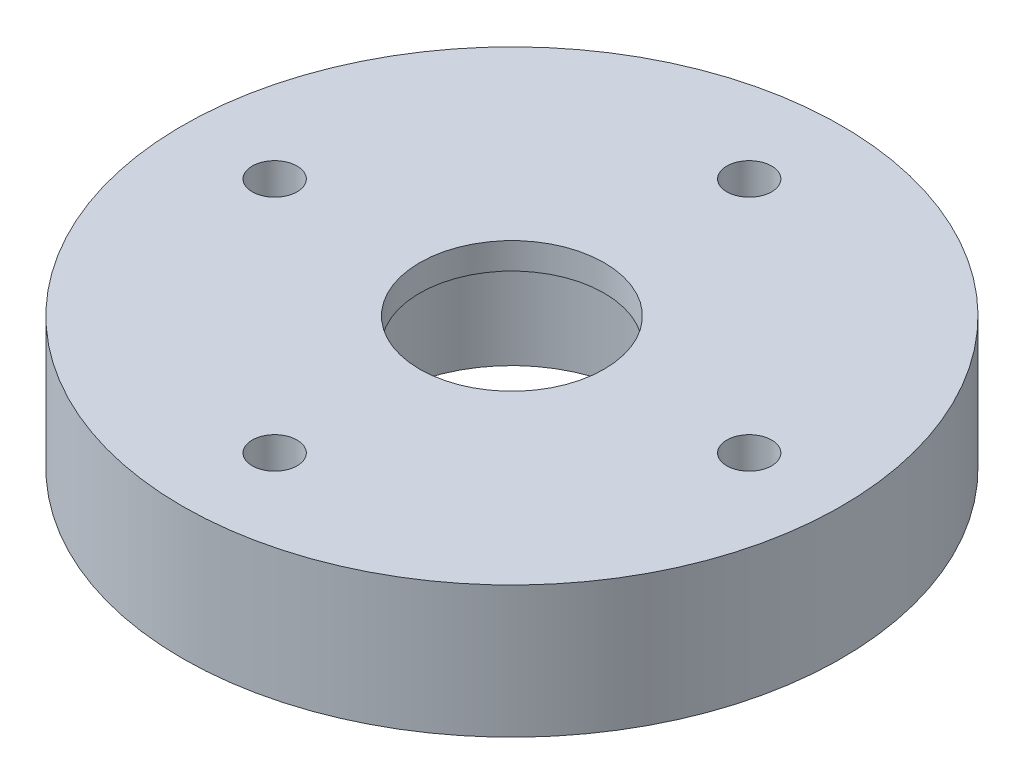
ISO-10303-21;
HEADER;
FILE_DESCRIPTION(('STEP AP214'),'2;1');
FILE_NAME('part.step','',(''),(''),'','','');
FILE_SCHEMA(('AUTOMOTIVE_DESIGN { 1 0 10303 214 1 1 1 1 }'));
ENDSEC;
DATA;
#1=APPLICATION_CONTEXT('core data for automotive mechanical design processes');
#2=APPLICATION_PROTOCOL_DEFINITION('international standard','automotive_design',2000,#1);
#3=PRODUCT_CONTEXT('',#1,'mechanical');
#4=PRODUCT('Part','Part','',(#3));
#5=PRODUCT_RELATED_PRODUCT_CATEGORY('part','',(#4));
#6=PRODUCT_DEFINITION_FORMATION('','',#4);
#7=PRODUCT_DEFINITION_CONTEXT('part definition',#1,'design');
#8=PRODUCT_DEFINITION('design','',#6,#7);
#9=PRODUCT_DEFINITION_SHAPE('','',#8);
#10=(LENGTH_UNIT() NAMED_UNIT(*) SI_UNIT(.MILLI.,.METRE.));
#11=(NAMED_UNIT(*) PLANE_ANGLE_UNIT() SI_UNIT($,.RADIAN.));
#12=(NAMED_UNIT(*) SI_UNIT($,.STERADIAN.) SOLID_ANGLE_UNIT());
#13=UNCERTAINTY_MEASURE_WITH_UNIT(LENGTH_MEASURE(1.E-05),#10,'distance_accuracy_value','');
#14=(GEOMETRIC_REPRESENTATION_CONTEXT(3) GLOBAL_UNCERTAINTY_ASSIGNED_CONTEXT((#13)) GLOBAL_UNIT_ASSIGNED_CONTEXT((#10,
#11,#12)) REPRESENTATION_CONTEXT('',''));
#15=CARTESIAN_POINT('',(0.,0.,0.));
#16=DIRECTION('',(0.,0.,1.));
#17=DIRECTION('',(1.,0.,0.));
#18=AXIS2_PLACEMENT_3D('',#15,#16,#17);
#19=CARTESIAN_POINT('',(0.,10.,-18.));
#20=DIRECTION('',(0.,-1.,0.));
#21=DIRECTION('',(0.,0.,-1.));
#22=AXIS2_PLACEMENT_3D('',#19,#20,#21);
#23=CYLINDRICAL_SURFACE('',#22,1.7);
#24=CARTESIAN_POINT('',(0.,10.,-18.));
#25=DIRECTION('',(0.,1.,0.));
#26=DIRECTION('',(0.,0.,1.));
#27=AXIS2_PLACEMENT_3D('',#24,#25,#26);
#28=CIRCLE('',#27,1.7);
#29=CARTESIAN_POINT('',(0.,10.,-16.3));
#30=VERTEX_POINT('',#29);
#31=EDGE_CURVE('E83',#30,#30,#28,.T.);
#32=ORIENTED_EDGE('',*,*,#31,.T.);
#33=EDGE_LOOP('',(#32));
#34=FACE_BOUND('',#33,.T.);
#35=CARTESIAN_POINT('',(0.,7.,-18.));
#36=DIRECTION('',(0.,-1.,0.));
#37=DIRECTION('',(0.,0.,-1.));
#38=AXIS2_PLACEMENT_3D('',#35,#36,#37);
#39=CIRCLE('',#38,1.7);
#40=CARTESIAN_POINT('',(0.,7.,-19.7));
#41=VERTEX_POINT('',#40);
#42=EDGE_CURVE('E35',#41,#41,#39,.T.);
#43=ORIENTED_EDGE('',*,*,#42,.T.);
#44=EDGE_LOOP('',(#43));
#45=FACE_BOUND('',#44,.T.);
#46=ADVANCED_FACE('F31',(#34,#45),#23,.F.);
#47=CARTESIAN_POINT('',(18.0000000000005,10.,-5.08284223389574E-13));
#48=DIRECTION('',(0.,-1.,0.));
#49=DIRECTION('',(0.,0.,-1.));
#50=AXIS2_PLACEMENT_3D('',#47,#48,#49);
#51=CYLINDRICAL_SURFACE('',#50,1.7000000000004);
#52=CARTESIAN_POINT('',(18.0000000000005,10.,-5.08284223389574E-13));
#53=DIRECTION('',(0.,1.,0.));
#54=DIRECTION('',(0.,0.,1.));
#55=AXIS2_PLACEMENT_3D('',#52,#53,#54);
#56=CIRCLE('',#55,1.7000000000004);
#57=CARTESIAN_POINT('',(18.0000000000005,10.,1.69999999999989));
#58=VERTEX_POINT('',#57);
#59=EDGE_CURVE('E81',#58,#58,#56,.T.);
#60=ORIENTED_EDGE('',*,*,#59,.T.);
#61=EDGE_LOOP('',(#60));
#62=FACE_BOUND('',#61,.T.);
#63=CARTESIAN_POINT('',(18.0000000000005,7.,-5.08284223389574E-13));
#64=DIRECTION('',(0.,-1.,0.));
#65=DIRECTION('',(0.,0.,-1.));
#66=AXIS2_PLACEMENT_3D('',#63,#64,#65);
#67=CIRCLE('',#66,1.7000000000004);
#68=CARTESIAN_POINT('',(18.0000000000005,7.,-1.70000000000091));
#69=VERTEX_POINT('',#68);
#70=EDGE_CURVE('E60',#69,#69,#67,.T.);
#71=ORIENTED_EDGE('',*,*,#70,.T.);
#72=EDGE_LOOP('',(#71));
#73=FACE_BOUND('',#72,.T.);
#74=ADVANCED_FACE('F159',(#62,#73),#51,.F.);
#75=CARTESIAN_POINT('',(1.01656844677915E-12,10.,18.));
#76=DIRECTION('',(0.,-1.,0.));
#77=DIRECTION('',(0.,0.,-1.));
#78=AXIS2_PLACEMENT_3D('',#75,#76,#77);
#79=CYLINDRICAL_SURFACE('',#78,1.70000000000109);
#80=CARTESIAN_POINT('',(1.01656844677915E-12,10.,18.));
#81=DIRECTION('',(0.,1.,0.));
#82=DIRECTION('',(0.,0.,1.));
#83=AXIS2_PLACEMENT_3D('',#80,#81,#82);
#84=CIRCLE('',#83,1.70000000000109);
#85=CARTESIAN_POINT('',(1.01656844677915E-12,10.,19.7000000000011));
#86=VERTEX_POINT('',#85);
#87=EDGE_CURVE('E78',#86,#86,#84,.T.);
#88=ORIENTED_EDGE('',*,*,#87,.T.);
#89=EDGE_LOOP('',(#88));
#90=FACE_BOUND('',#89,.T.);
#91=CARTESIAN_POINT('',(1.01656844677915E-12,7.,18.));
#92=DIRECTION('',(0.,-1.,0.));
#93=DIRECTION('',(0.,0.,-1.));
#94=AXIS2_PLACEMENT_3D('',#91,#92,#93);
#95=CIRCLE('',#94,1.70000000000109);
#96=CARTESIAN_POINT('',(1.01656844677915E-12,7.,16.2999999999989));
#97=VERTEX_POINT('',#96);
#98=EDGE_CURVE('E57',#97,#97,#95,.T.);
#99=ORIENTED_EDGE('',*,*,#98,.T.);
#100=EDGE_LOOP('',(#99));
#101=FACE_BOUND('',#100,.T.);
#102=ADVANCED_FACE('F106',(#90,#101),#79,.F.);
#103=CARTESIAN_POINT('',(-17.9999999999995,10.,5.10488587628039E-13));
#104=DIRECTION('',(0.,-1.,0.));
#105=DIRECTION('',(0.,0.,-1.));
#106=AXIS2_PLACEMENT_3D('',#103,#104,#105);
#107=CYLINDRICAL_SURFACE('',#106,1.70000000000082);
#108=CARTESIAN_POINT('',(-17.9999999999995,10.,5.10488587628039E-13));
#109=DIRECTION('',(0.,1.,0.));
#110=DIRECTION('',(0.,0.,1.));
#111=AXIS2_PLACEMENT_3D('',#108,#109,#110);
#112=CIRCLE('',#111,1.70000000000082);
#113=CARTESIAN_POINT('',(-17.9999999999995,10.,1.70000000000133));
#114=VERTEX_POINT('',#113);
#115=EDGE_CURVE('E52',#114,#114,#112,.T.);
#116=ORIENTED_EDGE('',*,*,#115,.T.);
#117=EDGE_LOOP('',(#116));
#118=FACE_BOUND('',#117,.T.);
#119=CARTESIAN_POINT('',(-17.9999999999995,7.,5.10488587628039E-13));
#120=DIRECTION('',(0.,-1.,0.));
#121=DIRECTION('',(0.,0.,-1.));
#122=AXIS2_PLACEMENT_3D('',#119,#120,#121);
#123=CIRCLE('',#122,1.70000000000082);
#124=CARTESIAN_POINT('',(-17.9999999999995,7.,-1.7000000000003));
#125=VERTEX_POINT('',#124);
#126=EDGE_CURVE('E54',#125,#125,#123,.T.);
#127=ORIENTED_EDGE('',*,*,#126,.T.);
#128=EDGE_LOOP('',(#127));
#129=FACE_BOUND('',#128,.T.);
#130=ADVANCED_FACE('F103',(#118,#129),#107,.F.);
#131=CARTESIAN_POINT('',(0.,10.,0.));
#132=DIRECTION('',(0.,-1.,0.));
#133=DIRECTION('',(0.,0.,-1.));
#134=AXIS2_PLACEMENT_3D('',#131,#132,#133);
#135=CYLINDRICAL_SURFACE('',#134,7.);
#136=CARTESIAN_POINT('',(0.,10.,0.));
#137=DIRECTION('',(0.,1.,0.));
#138=DIRECTION('',(0.,0.,1.));
#139=AXIS2_PLACEMENT_3D('',#136,#137,#138);
#140=CIRCLE('',#139,7.);
#141=CARTESIAN_POINT('',(0.,10.,7.));
#142=VERTEX_POINT('',#141);
#143=EDGE_CURVE('E44',#142,#142,#140,.T.);
#144=ORIENTED_EDGE('',*,*,#143,.T.);
#145=EDGE_LOOP('',(#144));
#146=FACE_BOUND('',#145,.T.);
#147=CARTESIAN_POINT('',(0.,8.,0.));
#148=DIRECTION('',(0.,-1.,0.));
#149=DIRECTION('',(0.,0.,-1.));
#150=AXIS2_PLACEMENT_3D('',#147,#148,#149);
#151=CIRCLE('',#150,7.);
#152=CARTESIAN_POINT('',(0.,8.,-7.));
#153=VERTEX_POINT('',#152);
#154=EDGE_CURVE('E49',#153,#153,#151,.T.);
#155=ORIENTED_EDGE('',*,*,#154,.T.);
#156=EDGE_LOOP('',(#155));
#157=FACE_BOUND('',#156,.T.);
#158=ADVANCED_FACE('F90',(#146,#157),#135,.F.);
#159=CARTESIAN_POINT('',(0.,10.,0.));
#160=DIRECTION('',(0.,1.,0.));
#161=DIRECTION('',(0.,0.,1.));
#162=AXIS2_PLACEMENT_3D('',#159,#160,#161);
#163=PLANE('',#162);
#164=ORIENTED_EDGE('',*,*,#87,.F.);
#165=EDGE_LOOP('',(#164));
#166=FACE_BOUND('',#165,.T.);
#167=ORIENTED_EDGE('',*,*,#31,.F.);
#168=EDGE_LOOP('',(#167));
#169=FACE_BOUND('',#168,.T.);
#170=CARTESIAN_POINT('',(0.,10.,0.));
#171=DIRECTION('',(0.,1.,0.));
#172=DIRECTION('',(0.,0.,1.));
#173=AXIS2_PLACEMENT_3D('',#170,#171,#172);
#174=CIRCLE('',#173,25.);
#175=CARTESIAN_POINT('',(0.,10.,25.));
#176=VERTEX_POINT('',#175);
#177=EDGE_CURVE('E10',#176,#176,#174,.T.);
#178=ORIENTED_EDGE('',*,*,#177,.T.);
#179=EDGE_LOOP('',(#178));
#180=FACE_BOUND('',#179,.T.);
#181=ORIENTED_EDGE('',*,*,#143,.F.);
#182=EDGE_LOOP('',(#181));
#183=FACE_BOUND('',#182,.T.);
#184=ORIENTED_EDGE('',*,*,#59,.F.);
#185=EDGE_LOOP('',(#184));
#186=FACE_BOUND('',#185,.T.);
#187=ORIENTED_EDGE('',*,*,#115,.F.);
#188=EDGE_LOOP('',(#187));
#189=FACE_BOUND('',#188,.T.);
#190=ADVANCED_FACE('F93',(#166,#169,#180,#183,#186,#189),#163,.T.);
#191=CARTESIAN_POINT('',(0.,0.,0.));
#192=DIRECTION('',(0.,1.,0.));
#193=DIRECTION('',(0.,0.,1.));
#194=AXIS2_PLACEMENT_3D('',#191,#192,#193);
#195=PLANE('',#194);
#196=CARTESIAN_POINT('',(1.01656844677915E-12,0.,18.));
#197=DIRECTION('',(0.,-1.,0.));
#198=DIRECTION('',(0.,0.,-1.));
#199=AXIS2_PLACEMENT_3D('',#196,#197,#198);
#200=CIRCLE('',#199,3.);
#201=CARTESIAN_POINT('',(1.01656844677915E-12,0.,15.));
#202=VERTEX_POINT('',#201);
#203=EDGE_CURVE('E120',#202,#202,#200,.T.);
#204=ORIENTED_EDGE('',*,*,#203,.F.);
#205=EDGE_LOOP('',(#204));
#206=FACE_BOUND('',#205,.T.);
#207=CARTESIAN_POINT('',(-17.9999999999995,0.,5.10008701937181E-13));
#208=DIRECTION('',(0.,-1.,0.));
#209=DIRECTION('',(0.,0.,-1.));
#210=AXIS2_PLACEMENT_3D('',#207,#208,#209);
#211=CIRCLE('',#210,3.);
#212=CARTESIAN_POINT('',(-17.9999999999995,0.,-2.99999999999949));
#213=VERTEX_POINT('',#212);
#214=EDGE_CURVE('E121',#213,#213,#211,.T.);
#215=ORIENTED_EDGE('',*,*,#214,.F.);
#216=EDGE_LOOP('',(#215));
#217=FACE_BOUND('',#216,.T.);
#218=CARTESIAN_POINT('',(0.,0.,-18.));
#219=DIRECTION('',(0.,-1.,0.));
#220=DIRECTION('',(0.,0.,-1.));
#221=AXIS2_PLACEMENT_3D('',#218,#219,#220);
#222=CIRCLE('',#221,3.);
#223=CARTESIAN_POINT('',(0.,0.,-21.));
#224=VERTEX_POINT('',#223);
#225=EDGE_CURVE('E132',#224,#224,#222,.T.);
#226=ORIENTED_EDGE('',*,*,#225,.F.);
#227=EDGE_LOOP('',(#226));
#228=FACE_BOUND('',#227,.T.);
#229=CARTESIAN_POINT('',(18.0000000000005,0.,-5.10008701937181E-13));
#230=DIRECTION('',(0.,-1.,0.));
#231=DIRECTION('',(0.,0.,-1.));
#232=AXIS2_PLACEMENT_3D('',#229,#230,#231);
#233=CIRCLE('',#232,3.);
#234=CARTESIAN_POINT('',(18.0000000000005,0.,-3.00000000000051));
#235=VERTEX_POINT('',#234);
#236=EDGE_CURVE('E137',#235,#235,#233,.T.);
#237=ORIENTED_EDGE('',*,*,#236,.F.);
#238=EDGE_LOOP('',(#237));
#239=FACE_BOUND('',#238,.T.);
#240=CARTESIAN_POINT('',(0.,0.,0.));
#241=DIRECTION('',(0.,-1.,0.));
#242=DIRECTION('',(0.,0.,-1.));
#243=AXIS2_PLACEMENT_3D('',#240,#241,#242);
#244=CIRCLE('',#243,9.53);
#245=CARTESIAN_POINT('',(0.,0.,-9.53));
#246=VERTEX_POINT('',#245);
#247=EDGE_CURVE('E65',#246,#246,#244,.T.);
#248=ORIENTED_EDGE('',*,*,#247,.F.);
#249=EDGE_LOOP('',(#248));
#250=FACE_BOUND('',#249,.T.);
#251=CARTESIAN_POINT('',(0.,0.,0.));
#252=DIRECTION('',(0.,1.,0.));
#253=DIRECTION('',(0.,0.,1.));
#254=AXIS2_PLACEMENT_3D('',#251,#252,#253);
#255=CIRCLE('',#254,25.);
#256=CARTESIAN_POINT('',(0.,0.,25.));
#257=VERTEX_POINT('',#256);
#258=EDGE_CURVE('E39',#257,#257,#255,.T.);
#259=ORIENTED_EDGE('',*,*,#258,.F.);
#260=EDGE_LOOP('',(#259));
#261=FACE_BOUND('',#260,.T.);
#262=ADVANCED_FACE('F96',(#206,#217,#228,#239,#250,#261),#195,.F.);
#263=CARTESIAN_POINT('',(0.,10.,0.));
#264=DIRECTION('',(0.,-1.,0.));
#265=DIRECTION('',(0.,0.,-1.));
#266=AXIS2_PLACEMENT_3D('',#263,#264,#265);
#267=CYLINDRICAL_SURFACE('',#266,25.);
#268=ORIENTED_EDGE('',*,*,#177,.F.);
#269=EDGE_LOOP('',(#268));
#270=FACE_BOUND('',#269,.T.);
#271=ORIENTED_EDGE('',*,*,#258,.T.);
#272=EDGE_LOOP('',(#271));
#273=FACE_BOUND('',#272,.T.);
#274=ADVANCED_FACE('F33',(#270,#273),#267,.T.);
#275=CARTESIAN_POINT('',(0.,8.,0.));
#276=DIRECTION('',(0.,-1.,0.));
#277=DIRECTION('',(0.,0.,-1.));
#278=AXIS2_PLACEMENT_3D('',#275,#276,#277);
#279=CYLINDRICAL_SURFACE('',#278,9.53);
#280=CARTESIAN_POINT('',(0.,8.,0.));
#281=DIRECTION('',(0.,-1.,0.));
#282=DIRECTION('',(0.,0.,-1.));
#283=AXIS2_PLACEMENT_3D('',#280,#281,#282);
#284=CIRCLE('',#283,9.53);
#285=CARTESIAN_POINT('',(0.,8.,-9.53));
#286=VERTEX_POINT('',#285);
#287=EDGE_CURVE('E53',#286,#286,#284,.T.);
#288=ORIENTED_EDGE('',*,*,#287,.F.);
#289=EDGE_LOOP('',(#288));
#290=FACE_BOUND('',#289,.T.);
#291=ORIENTED_EDGE('',*,*,#247,.T.);
#292=EDGE_LOOP('',(#291));
#293=FACE_BOUND('',#292,.T.);
#294=ADVANCED_FACE('F150',(#290,#293),#279,.F.);
#295=CARTESIAN_POINT('',(0.,8.,0.));
#296=DIRECTION('',(0.,-1.,0.));
#297=DIRECTION('',(0.,0.,-1.));
#298=AXIS2_PLACEMENT_3D('',#295,#296,#297);
#299=PLANE('',#298);
#300=ORIENTED_EDGE('',*,*,#154,.F.);
#301=EDGE_LOOP('',(#300));
#302=FACE_BOUND('',#301,.T.);
#303=ORIENTED_EDGE('',*,*,#287,.T.);
#304=EDGE_LOOP('',(#303));
#305=FACE_BOUND('',#304,.T.);
#306=ADVANCED_FACE('F155',(#302,#305),#299,.T.);
#307=CARTESIAN_POINT('',(-17.9999999999995,7.,5.10008701937181E-13));
#308=DIRECTION('',(0.,-1.,0.));
#309=DIRECTION('',(0.,0.,-1.));
#310=AXIS2_PLACEMENT_3D('',#307,#308,#309);
#311=CYLINDRICAL_SURFACE('',#310,3.);
#312=CARTESIAN_POINT('',(-17.9999999999995,7.,5.10008701937181E-13));
#313=DIRECTION('',(0.,-1.,0.));
#314=DIRECTION('',(0.,0.,-1.));
#315=AXIS2_PLACEMENT_3D('',#312,#313,#314);
#316=CIRCLE('',#315,3.);
#317=CARTESIAN_POINT('',(-17.9999999999995,7.,-2.99999999999949));
#318=VERTEX_POINT('',#317);
#319=EDGE_CURVE('E118',#318,#318,#316,.T.);
#320=ORIENTED_EDGE('',*,*,#319,.F.);
#321=EDGE_LOOP('',(#320));
#322=FACE_BOUND('',#321,.T.);
#323=ORIENTED_EDGE('',*,*,#214,.T.);
#324=EDGE_LOOP('',(#323));
#325=FACE_BOUND('',#324,.T.);
#326=ADVANCED_FACE('F114',(#322,#325),#311,.F.);
#327=CARTESIAN_POINT('',(-17.9999999999995,7.,5.10008701937181E-13));
#328=DIRECTION('',(0.,-1.,0.));
#329=DIRECTION('',(0.,0.,-1.));
#330=AXIS2_PLACEMENT_3D('',#327,#328,#329);
#331=PLANE('',#330);
#332=ORIENTED_EDGE('',*,*,#126,.F.);
#333=EDGE_LOOP('',(#332));
#334=FACE_BOUND('',#333,.T.);
#335=ORIENTED_EDGE('',*,*,#319,.T.);
#336=EDGE_LOOP('',(#335));
#337=FACE_BOUND('',#336,.T.);
#338=ADVANCED_FACE('F110',(#334,#337),#331,.T.);
#339=CARTESIAN_POINT('',(1.01656844677915E-12,7.,18.));
#340=DIRECTION('',(0.,-1.,0.));
#341=DIRECTION('',(0.,0.,-1.));
#342=AXIS2_PLACEMENT_3D('',#339,#340,#341);
#343=CYLINDRICAL_SURFACE('',#342,3.);
#344=CARTESIAN_POINT('',(1.01656844677915E-12,7.,18.));
#345=DIRECTION('',(0.,-1.,0.));
#346=DIRECTION('',(0.,0.,-1.));
#347=AXIS2_PLACEMENT_3D('',#344,#345,#346);
#348=CIRCLE('',#347,3.);
#349=CARTESIAN_POINT('',(1.01656844677915E-12,7.,15.));
#350=VERTEX_POINT('',#349);
#351=EDGE_CURVE('E58',#350,#350,#348,.T.);
#352=ORIENTED_EDGE('',*,*,#351,.F.);
#353=EDGE_LOOP('',(#352));
#354=FACE_BOUND('',#353,.T.);
#355=ORIENTED_EDGE('',*,*,#203,.T.);
#356=EDGE_LOOP('',(#355));
#357=FACE_BOUND('',#356,.T.);
#358=ADVANCED_FACE('F113',(#354,#357),#343,.F.);
#359=CARTESIAN_POINT('',(1.01656844677915E-12,7.,18.));
#360=DIRECTION('',(0.,-1.,0.));
#361=DIRECTION('',(0.,0.,-1.));
#362=AXIS2_PLACEMENT_3D('',#359,#360,#361);
#363=PLANE('',#362);
#364=ORIENTED_EDGE('',*,*,#98,.F.);
#365=EDGE_LOOP('',(#364));
#366=FACE_BOUND('',#365,.T.);
#367=ORIENTED_EDGE('',*,*,#351,.T.);
#368=EDGE_LOOP('',(#367));
#369=FACE_BOUND('',#368,.T.);
#370=ADVANCED_FACE('F212',(#366,#369),#363,.T.);
#371=CARTESIAN_POINT('',(18.0000000000005,7.,-5.10008701937181E-13));
#372=DIRECTION('',(0.,-1.,0.));
#373=DIRECTION('',(0.,0.,-1.));
#374=AXIS2_PLACEMENT_3D('',#371,#372,#373);
#375=CYLINDRICAL_SURFACE('',#374,3.);
#376=CARTESIAN_POINT('',(18.0000000000005,7.,-5.10008701937181E-13));
#377=DIRECTION('',(0.,-1.,0.));
#378=DIRECTION('',(0.,0.,-1.));
#379=AXIS2_PLACEMENT_3D('',#376,#377,#378);
#380=CIRCLE('',#379,3.);
#381=CARTESIAN_POINT('',(18.0000000000005,7.,-3.00000000000051));
#382=VERTEX_POINT('',#381);
#383=EDGE_CURVE('E135',#382,#382,#380,.T.);
#384=ORIENTED_EDGE('',*,*,#383,.F.);
#385=EDGE_LOOP('',(#384));
#386=FACE_BOUND('',#385,.T.);
#387=ORIENTED_EDGE('',*,*,#236,.T.);
#388=EDGE_LOOP('',(#387));
#389=FACE_BOUND('',#388,.T.);
#390=ADVANCED_FACE('F141',(#386,#389),#375,.F.);
#391=CARTESIAN_POINT('',(18.0000000000005,7.,-5.10008701937181E-13));
#392=DIRECTION('',(0.,-1.,0.));
#393=DIRECTION('',(0.,0.,-1.));
#394=AXIS2_PLACEMENT_3D('',#391,#392,#393);
#395=PLANE('',#394);
#396=ORIENTED_EDGE('',*,*,#70,.F.);
#397=EDGE_LOOP('',(#396));
#398=FACE_BOUND('',#397,.T.);
#399=ORIENTED_EDGE('',*,*,#383,.T.);
#400=EDGE_LOOP('',(#399));
#401=FACE_BOUND('',#400,.T.);
#402=ADVANCED_FACE('F231',(#398,#401),#395,.T.);
#403=CARTESIAN_POINT('',(0.,7.,-18.));
#404=DIRECTION('',(0.,-1.,0.));
#405=DIRECTION('',(0.,0.,-1.));
#406=AXIS2_PLACEMENT_3D('',#403,#404,#405);
#407=CYLINDRICAL_SURFACE('',#406,3.);
#408=CARTESIAN_POINT('',(0.,7.,-18.));
#409=DIRECTION('',(0.,-1.,0.));
#410=DIRECTION('',(0.,0.,-1.));
#411=AXIS2_PLACEMENT_3D('',#408,#409,#410);
#412=CIRCLE('',#411,3.);
#413=CARTESIAN_POINT('',(0.,7.,-21.));
#414=VERTEX_POINT('',#413);
#415=EDGE_CURVE('E126',#414,#414,#412,.T.);
#416=ORIENTED_EDGE('',*,*,#415,.F.);
#417=EDGE_LOOP('',(#416));
#418=FACE_BOUND('',#417,.T.);
#419=ORIENTED_EDGE('',*,*,#225,.T.);
#420=EDGE_LOOP('',(#419));
#421=FACE_BOUND('',#420,.T.);
#422=ADVANCED_FACE('F241',(#418,#421),#407,.F.);
#423=CARTESIAN_POINT('',(0.,7.,-18.));
#424=DIRECTION('',(0.,-1.,0.));
#425=DIRECTION('',(0.,0.,-1.));
#426=AXIS2_PLACEMENT_3D('',#423,#424,#425);
#427=PLANE('',#426);
#428=ORIENTED_EDGE('',*,*,#42,.F.);
#429=EDGE_LOOP('',(#428));
#430=FACE_BOUND('',#429,.T.);
#431=ORIENTED_EDGE('',*,*,#415,.T.);
#432=EDGE_LOOP('',(#431));
#433=FACE_BOUND('',#432,.T.);
#434=ADVANCED_FACE('F251',(#430,#433),#427,.T.);
#435=CLOSED_SHELL('',(#46,#74,#102,#130,#158,#190,#262,#274,#294,#306,#326,#338,#358,#370,#390,
#402,#422,#434));
#436=MANIFOLD_SOLID_BREP('B2',#435);
#437=ADVANCED_BREP_SHAPE_REPRESENTATION('',(#18,#436),#14);
#438=SHAPE_DEFINITION_REPRESENTATION(#9,#437);
ENDSEC;
END-ISO-10303-21;
